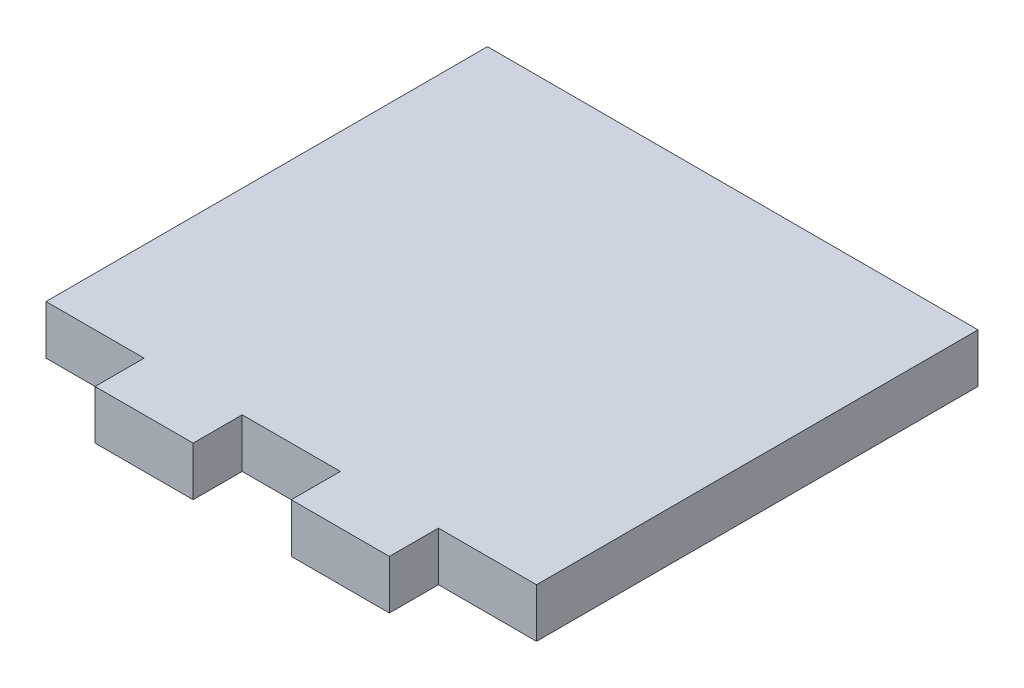
ISO-10303-21;
HEADER;
FILE_DESCRIPTION(('STEP AP214'),'2;1');
FILE_NAME('part.step','',(''),(''),'','','');
FILE_SCHEMA(('AUTOMOTIVE_DESIGN { 1 0 10303 214 1 1 1 1 }'));
ENDSEC;
DATA;
#1=APPLICATION_CONTEXT('core data for automotive mechanical design processes');
#2=APPLICATION_PROTOCOL_DEFINITION('international standard','automotive_design',2000,#1);
#3=PRODUCT_CONTEXT('',#1,'mechanical');
#4=PRODUCT('Part','Part','',(#3));
#5=PRODUCT_RELATED_PRODUCT_CATEGORY('part','',(#4));
#6=PRODUCT_DEFINITION_FORMATION('','',#4);
#7=PRODUCT_DEFINITION_CONTEXT('part definition',#1,'design');
#8=PRODUCT_DEFINITION('design','',#6,#7);
#9=PRODUCT_DEFINITION_SHAPE('','',#8);
#10=(LENGTH_UNIT() NAMED_UNIT(*) SI_UNIT(.MILLI.,.METRE.));
#11=(NAMED_UNIT(*) PLANE_ANGLE_UNIT() SI_UNIT($,.RADIAN.));
#12=(NAMED_UNIT(*) SI_UNIT($,.STERADIAN.) SOLID_ANGLE_UNIT());
#13=UNCERTAINTY_MEASURE_WITH_UNIT(LENGTH_MEASURE(1.E-05),#10,'distance_accuracy_value','');
#14=(GEOMETRIC_REPRESENTATION_CONTEXT(3) GLOBAL_UNCERTAINTY_ASSIGNED_CONTEXT((#13)) GLOBAL_UNIT_ASSIGNED_CONTEXT((#10,
#11,#12)) REPRESENTATION_CONTEXT('',''));
#15=CARTESIAN_POINT('',(0.,0.,0.));
#16=DIRECTION('',(0.,0.,1.));
#17=DIRECTION('',(1.,0.,0.));
#18=AXIS2_PLACEMENT_3D('',#15,#16,#17);
#19=CARTESIAN_POINT('',(-50.,10.,50.));
#20=DIRECTION('',(0.,0.,-1.));
#21=DIRECTION('',(-1.,0.,0.));
#22=AXIS2_PLACEMENT_3D('',#19,#20,#21);
#23=PLANE('',#22);
#24=DIRECTION('',(1.,0.,0.));
#25=VECTOR('',#24,1.);
#26=CARTESIAN_POINT('',(-50.,0.,50.));
#27=LINE('',#26,#25);
#28=CARTESIAN_POINT('',(-30.,0.,50.));
#29=VERTEX_POINT('',#28);
#30=CARTESIAN_POINT('',(-10.,0.,50.));
#31=VERTEX_POINT('',#30);
#32=EDGE_CURVE('E156',#29,#31,#27,.T.);
#33=ORIENTED_EDGE('',*,*,#32,.T.);
#34=DIRECTION('',(0.,1.,0.));
#35=VECTOR('',#34,1.);
#36=CARTESIAN_POINT('',(-10.,0.,50.));
#37=LINE('',#36,#35);
#38=CARTESIAN_POINT('',(-10.,10.,50.));
#39=VERTEX_POINT('',#38);
#40=EDGE_CURVE('E194',#31,#39,#37,.T.);
#41=ORIENTED_EDGE('',*,*,#40,.T.);
#42=DIRECTION('',(1.,0.,0.));
#43=VECTOR('',#42,1.);
#44=CARTESIAN_POINT('',(-50.,10.,50.));
#45=LINE('',#44,#43);
#46=CARTESIAN_POINT('',(-30.,10.,50.));
#47=VERTEX_POINT('',#46);
#48=EDGE_CURVE('E150',#47,#39,#45,.T.);
#49=ORIENTED_EDGE('',*,*,#48,.F.);
#50=DIRECTION('',(0.,1.,0.));
#51=VECTOR('',#50,1.);
#52=CARTESIAN_POINT('',(-30.,0.,50.));
#53=LINE('',#52,#51);
#54=EDGE_CURVE('E179',#29,#47,#53,.T.);
#55=ORIENTED_EDGE('',*,*,#54,.F.);
#56=EDGE_LOOP('',(#33,#41,#49,#55));
#57=FACE_BOUND('',#56,.T.);
#58=ADVANCED_FACE('F33',(#57),#23,.F.);
#59=CARTESIAN_POINT('',(50.,10.,-50.));
#60=DIRECTION('',(-1.,0.,0.));
#61=DIRECTION('',(0.,0.,1.));
#62=AXIS2_PLACEMENT_3D('',#59,#60,#61);
#63=PLANE('',#62);
#64=DIRECTION('',(0.,0.,-1.));
#65=VECTOR('',#64,1.);
#66=CARTESIAN_POINT('',(50.,10.,-50.));
#67=LINE('',#66,#65);
#68=CARTESIAN_POINT('',(50.,10.,40.));
#69=VERTEX_POINT('',#68);
#70=CARTESIAN_POINT('',(50.,10.,-50.));
#71=VERTEX_POINT('',#70);
#72=EDGE_CURVE('E137',#69,#71,#67,.T.);
#73=ORIENTED_EDGE('',*,*,#72,.F.);
#74=DIRECTION('',(0.,1.,0.));
#75=VECTOR('',#74,1.);
#76=CARTESIAN_POINT('',(50.,0.,40.));
#77=LINE('',#76,#75);
#78=CARTESIAN_POINT('',(50.,0.,40.));
#79=VERTEX_POINT('',#78);
#80=EDGE_CURVE('E125',#79,#69,#77,.T.);
#81=ORIENTED_EDGE('',*,*,#80,.F.);
#82=DIRECTION('',(0.,0.,-1.));
#83=VECTOR('',#82,1.);
#84=CARTESIAN_POINT('',(50.,0.,-50.));
#85=LINE('',#84,#83);
#86=CARTESIAN_POINT('',(50.,0.,-50.));
#87=VERTEX_POINT('',#86);
#88=EDGE_CURVE('E135',#79,#87,#85,.T.);
#89=ORIENTED_EDGE('',*,*,#88,.T.);
#90=DIRECTION('',(0.,-1.,0.));
#91=VECTOR('',#90,1.);
#92=CARTESIAN_POINT('',(50.,10.,-50.));
#93=LINE('',#92,#91);
#94=EDGE_CURVE('E11',#71,#87,#93,.T.);
#95=ORIENTED_EDGE('',*,*,#94,.F.);
#96=EDGE_LOOP('',(#73,#81,#89,#95));
#97=FACE_BOUND('',#96,.T.);
#98=ADVANCED_FACE('F35',(#97),#63,.F.);
#99=CARTESIAN_POINT('',(-50.,10.,-50.));
#100=DIRECTION('',(0.,0.,1.));
#101=DIRECTION('',(1.,0.,0.));
#102=AXIS2_PLACEMENT_3D('',#99,#100,#101);
#103=PLANE('',#102);
#104=DIRECTION('',(-1.,0.,0.));
#105=VECTOR('',#104,1.);
#106=CARTESIAN_POINT('',(-50.,0.,-50.));
#107=LINE('',#106,#105);
#108=CARTESIAN_POINT('',(-50.,0.,-50.));
#109=VERTEX_POINT('',#108);
#110=EDGE_CURVE('E141',#87,#109,#107,.T.);
#111=ORIENTED_EDGE('',*,*,#110,.T.);
#112=DIRECTION('',(0.,-1.,0.));
#113=VECTOR('',#112,1.);
#114=CARTESIAN_POINT('',(-50.,10.,-50.));
#115=LINE('',#114,#113);
#116=CARTESIAN_POINT('',(-50.,10.,-50.));
#117=VERTEX_POINT('',#116);
#118=EDGE_CURVE('E41',#117,#109,#115,.T.);
#119=ORIENTED_EDGE('',*,*,#118,.F.);
#120=DIRECTION('',(-1.,0.,0.));
#121=VECTOR('',#120,1.);
#122=CARTESIAN_POINT('',(-50.,10.,-50.));
#123=LINE('',#122,#121);
#124=EDGE_CURVE('E174',#71,#117,#123,.T.);
#125=ORIENTED_EDGE('',*,*,#124,.F.);
#126=ORIENTED_EDGE('',*,*,#94,.T.);
#127=EDGE_LOOP('',(#111,#119,#125,#126));
#128=FACE_BOUND('',#127,.T.);
#129=ADVANCED_FACE('F246',(#128),#103,.F.);
#130=CARTESIAN_POINT('',(-50.,10.,-50.));
#131=DIRECTION('',(1.,0.,0.));
#132=DIRECTION('',(0.,0.,-1.));
#133=AXIS2_PLACEMENT_3D('',#130,#131,#132);
#134=PLANE('',#133);
#135=DIRECTION('',(0.,0.,1.));
#136=VECTOR('',#135,1.);
#137=CARTESIAN_POINT('',(-50.,0.,-50.));
#138=LINE('',#137,#136);
#139=CARTESIAN_POINT('',(-50.,0.,40.));
#140=VERTEX_POINT('',#139);
#141=EDGE_CURVE('E144',#109,#140,#138,.T.);
#142=ORIENTED_EDGE('',*,*,#141,.T.);
#143=DIRECTION('',(0.,1.,0.));
#144=VECTOR('',#143,1.);
#145=CARTESIAN_POINT('',(-50.,0.,40.));
#146=LINE('',#145,#144);
#147=CARTESIAN_POINT('',(-50.,10.,40.));
#148=VERTEX_POINT('',#147);
#149=EDGE_CURVE('E142',#140,#148,#146,.T.);
#150=ORIENTED_EDGE('',*,*,#149,.T.);
#151=DIRECTION('',(0.,0.,1.));
#152=VECTOR('',#151,1.);
#153=CARTESIAN_POINT('',(-50.,10.,-50.));
#154=LINE('',#153,#152);
#155=EDGE_CURVE('E169',#117,#148,#154,.T.);
#156=ORIENTED_EDGE('',*,*,#155,.F.);
#157=ORIENTED_EDGE('',*,*,#118,.T.);
#158=EDGE_LOOP('',(#142,#150,#156,#157));
#159=FACE_BOUND('',#158,.T.);
#160=ADVANCED_FACE('F244',(#159),#134,.F.);
#161=CARTESIAN_POINT('',(10.,0.,50.));
#162=VERTEX_POINT('',#161);
#163=CARTESIAN_POINT('',(30.,0.,50.));
#164=VERTEX_POINT('',#163);
#165=EDGE_CURVE('E155',#162,#164,#27,.T.);
#166=ORIENTED_EDGE('',*,*,#165,.T.);
#167=DIRECTION('',(0.,1.,0.));
#168=VECTOR('',#167,1.);
#169=CARTESIAN_POINT('',(30.,0.,50.));
#170=LINE('',#169,#168);
#171=CARTESIAN_POINT('',(30.,10.,50.));
#172=VERTEX_POINT('',#171);
#173=EDGE_CURVE('E211',#164,#172,#170,.T.);
#174=ORIENTED_EDGE('',*,*,#173,.T.);
#175=CARTESIAN_POINT('',(10.,10.,50.));
#176=VERTEX_POINT('',#175);
#177=EDGE_CURVE('E163',#176,#172,#45,.T.);
#178=ORIENTED_EDGE('',*,*,#177,.F.);
#179=DIRECTION('',(0.,1.,0.));
#180=VECTOR('',#179,1.);
#181=CARTESIAN_POINT('',(10.,0.,50.));
#182=LINE('',#181,#180);
#183=EDGE_CURVE('E197',#162,#176,#182,.T.);
#184=ORIENTED_EDGE('',*,*,#183,.F.);
#185=EDGE_LOOP('',(#166,#174,#178,#184));
#186=FACE_BOUND('',#185,.T.);
#187=ADVANCED_FACE('F228',(#186),#23,.F.);
#188=CARTESIAN_POINT('',(0.,10.,0.));
#189=DIRECTION('',(0.,1.,0.));
#190=DIRECTION('',(0.,0.,1.));
#191=AXIS2_PLACEMENT_3D('',#188,#189,#190);
#192=PLANE('',#191);
#193=DIRECTION('',(0.,0.,1.));
#194=VECTOR('',#193,1.);
#195=CARTESIAN_POINT('',(30.,10.,50.));
#196=LINE('',#195,#194);
#197=CARTESIAN_POINT('',(30.,10.,40.));
#198=VERTEX_POINT('',#197);
#199=EDGE_CURVE('E130',#198,#172,#196,.T.);
#200=ORIENTED_EDGE('',*,*,#199,.F.);
#201=DIRECTION('',(-1.,0.,0.));
#202=VECTOR('',#201,1.);
#203=CARTESIAN_POINT('',(50.,10.,40.));
#204=LINE('',#203,#202);
#205=EDGE_CURVE('E222',#69,#198,#204,.T.);
#206=ORIENTED_EDGE('',*,*,#205,.F.);
#207=ORIENTED_EDGE('',*,*,#72,.T.);
#208=ORIENTED_EDGE('',*,*,#124,.T.);
#209=ORIENTED_EDGE('',*,*,#155,.T.);
#210=DIRECTION('',(-1.,0.,0.));
#211=VECTOR('',#210,1.);
#212=CARTESIAN_POINT('',(-50.,10.,40.));
#213=LINE('',#212,#211);
#214=CARTESIAN_POINT('',(-30.,10.,40.));
#215=VERTEX_POINT('',#214);
#216=EDGE_CURVE('E183',#215,#148,#213,.T.);
#217=ORIENTED_EDGE('',*,*,#216,.F.);
#218=DIRECTION('',(0.,0.,-1.));
#219=VECTOR('',#218,1.);
#220=CARTESIAN_POINT('',(-30.,10.,50.));
#221=LINE('',#220,#219);
#222=EDGE_CURVE('E186',#47,#215,#221,.T.);
#223=ORIENTED_EDGE('',*,*,#222,.F.);
#224=ORIENTED_EDGE('',*,*,#48,.T.);
#225=DIRECTION('',(0.,0.,1.));
#226=VECTOR('',#225,1.);
#227=CARTESIAN_POINT('',(-10.,10.,50.));
#228=LINE('',#227,#226);
#229=CARTESIAN_POINT('',(-10.,10.,40.));
#230=VERTEX_POINT('',#229);
#231=EDGE_CURVE('E209',#230,#39,#228,.T.);
#232=ORIENTED_EDGE('',*,*,#231,.F.);
#233=DIRECTION('',(-1.,0.,0.));
#234=VECTOR('',#233,1.);
#235=CARTESIAN_POINT('',(-10.,10.,40.));
#236=LINE('',#235,#234);
#237=CARTESIAN_POINT('',(10.,10.,40.));
#238=VERTEX_POINT('',#237);
#239=EDGE_CURVE('E202',#238,#230,#236,.T.);
#240=ORIENTED_EDGE('',*,*,#239,.F.);
#241=DIRECTION('',(0.,0.,-1.));
#242=VECTOR('',#241,1.);
#243=CARTESIAN_POINT('',(10.,10.,50.));
#244=LINE('',#243,#242);
#245=EDGE_CURVE('E206',#176,#238,#244,.T.);
#246=ORIENTED_EDGE('',*,*,#245,.F.);
#247=ORIENTED_EDGE('',*,*,#177,.T.);
#248=EDGE_LOOP('',(#200,#206,#207,#208,#209,#217,#223,#224,#232,#240,#246,#247));
#249=FACE_BOUND('',#248,.T.);
#250=ADVANCED_FACE('F232',(#249),#192,.T.);
#251=CARTESIAN_POINT('',(0.,0.,0.));
#252=DIRECTION('',(0.,1.,0.));
#253=DIRECTION('',(0.,0.,1.));
#254=AXIS2_PLACEMENT_3D('',#251,#252,#253);
#255=PLANE('',#254);
#256=DIRECTION('',(-1.,0.,0.));
#257=VECTOR('',#256,1.);
#258=CARTESIAN_POINT('',(50.,0.,40.));
#259=LINE('',#258,#257);
#260=CARTESIAN_POINT('',(30.,0.,40.));
#261=VERTEX_POINT('',#260);
#262=EDGE_CURVE('E121',#79,#261,#259,.T.);
#263=ORIENTED_EDGE('',*,*,#262,.T.);
#264=DIRECTION('',(0.,0.,1.));
#265=VECTOR('',#264,1.);
#266=CARTESIAN_POINT('',(30.,0.,50.));
#267=LINE('',#266,#265);
#268=EDGE_CURVE('E48',#261,#164,#267,.T.);
#269=ORIENTED_EDGE('',*,*,#268,.T.);
#270=ORIENTED_EDGE('',*,*,#165,.F.);
#271=DIRECTION('',(0.,0.,-1.));
#272=VECTOR('',#271,1.);
#273=CARTESIAN_POINT('',(10.,0.,50.));
#274=LINE('',#273,#272);
#275=CARTESIAN_POINT('',(10.,0.,40.));
#276=VERTEX_POINT('',#275);
#277=EDGE_CURVE('E213',#162,#276,#274,.T.);
#278=ORIENTED_EDGE('',*,*,#277,.T.);
#279=DIRECTION('',(-1.,0.,0.));
#280=VECTOR('',#279,1.);
#281=CARTESIAN_POINT('',(-10.,0.,40.));
#282=LINE('',#281,#280);
#283=CARTESIAN_POINT('',(-10.,0.,40.));
#284=VERTEX_POINT('',#283);
#285=EDGE_CURVE('E56',#276,#284,#282,.T.);
#286=ORIENTED_EDGE('',*,*,#285,.T.);
#287=DIRECTION('',(0.,0.,1.));
#288=VECTOR('',#287,1.);
#289=CARTESIAN_POINT('',(-10.,0.,50.));
#290=LINE('',#289,#288);
#291=EDGE_CURVE('E205',#284,#31,#290,.T.);
#292=ORIENTED_EDGE('',*,*,#291,.T.);
#293=ORIENTED_EDGE('',*,*,#32,.F.);
#294=DIRECTION('',(0.,0.,-1.));
#295=VECTOR('',#294,1.);
#296=CARTESIAN_POINT('',(-30.,0.,50.));
#297=LINE('',#296,#295);
#298=CARTESIAN_POINT('',(-30.,0.,40.));
#299=VERTEX_POINT('',#298);
#300=EDGE_CURVE('E185',#29,#299,#297,.T.);
#301=ORIENTED_EDGE('',*,*,#300,.T.);
#302=DIRECTION('',(-1.,0.,0.));
#303=VECTOR('',#302,1.);
#304=CARTESIAN_POINT('',(-50.,0.,40.));
#305=LINE('',#304,#303);
#306=EDGE_CURVE('E181',#299,#140,#305,.T.);
#307=ORIENTED_EDGE('',*,*,#306,.T.);
#308=ORIENTED_EDGE('',*,*,#141,.F.);
#309=ORIENTED_EDGE('',*,*,#110,.F.);
#310=ORIENTED_EDGE('',*,*,#88,.F.);
#311=EDGE_LOOP('',(#263,#269,#270,#278,#286,#292,#293,#301,#307,#308,#309,#310));
#312=FACE_BOUND('',#311,.T.);
#313=ADVANCED_FACE('F139',(#312),#255,.F.);
#314=CARTESIAN_POINT('',(-50.,0.,40.));
#315=DIRECTION('',(0.,0.,-1.));
#316=DIRECTION('',(-1.,0.,0.));
#317=AXIS2_PLACEMENT_3D('',#314,#315,#316);
#318=PLANE('',#317);
#319=ORIENTED_EDGE('',*,*,#216,.T.);
#320=ORIENTED_EDGE('',*,*,#149,.F.);
#321=ORIENTED_EDGE('',*,*,#306,.F.);
#322=DIRECTION('',(0.,1.,0.));
#323=VECTOR('',#322,1.);
#324=CARTESIAN_POINT('',(-30.,0.,40.));
#325=LINE('',#324,#323);
#326=EDGE_CURVE('E147',#299,#215,#325,.T.);
#327=ORIENTED_EDGE('',*,*,#326,.T.);
#328=EDGE_LOOP('',(#319,#320,#321,#327));
#329=FACE_BOUND('',#328,.T.);
#330=ADVANCED_FACE('F243',(#329),#318,.F.);
#331=CARTESIAN_POINT('',(-30.,0.,50.));
#332=DIRECTION('',(1.,0.,0.));
#333=DIRECTION('',(0.,0.,-1.));
#334=AXIS2_PLACEMENT_3D('',#331,#332,#333);
#335=PLANE('',#334);
#336=ORIENTED_EDGE('',*,*,#222,.T.);
#337=ORIENTED_EDGE('',*,*,#326,.F.);
#338=ORIENTED_EDGE('',*,*,#300,.F.);
#339=ORIENTED_EDGE('',*,*,#54,.T.);
#340=EDGE_LOOP('',(#336,#337,#338,#339));
#341=FACE_BOUND('',#340,.T.);
#342=ADVANCED_FACE('F240',(#341),#335,.F.);
#343=CARTESIAN_POINT('',(-10.,0.,50.));
#344=DIRECTION('',(-1.,0.,0.));
#345=DIRECTION('',(0.,0.,1.));
#346=AXIS2_PLACEMENT_3D('',#343,#344,#345);
#347=PLANE('',#346);
#348=ORIENTED_EDGE('',*,*,#231,.T.);
#349=ORIENTED_EDGE('',*,*,#40,.F.);
#350=ORIENTED_EDGE('',*,*,#291,.F.);
#351=DIRECTION('',(0.,1.,0.));
#352=VECTOR('',#351,1.);
#353=CARTESIAN_POINT('',(-10.,0.,40.));
#354=LINE('',#353,#352);
#355=EDGE_CURVE('E189',#284,#230,#354,.T.);
#356=ORIENTED_EDGE('',*,*,#355,.T.);
#357=EDGE_LOOP('',(#348,#349,#350,#356));
#358=FACE_BOUND('',#357,.T.);
#359=ADVANCED_FACE('F265',(#358),#347,.F.);
#360=CARTESIAN_POINT('',(-10.,0.,40.));
#361=DIRECTION('',(0.,0.,-1.));
#362=DIRECTION('',(-1.,0.,0.));
#363=AXIS2_PLACEMENT_3D('',#360,#361,#362);
#364=PLANE('',#363);
#365=ORIENTED_EDGE('',*,*,#239,.T.);
#366=ORIENTED_EDGE('',*,*,#355,.F.);
#367=ORIENTED_EDGE('',*,*,#285,.F.);
#368=DIRECTION('',(0.,1.,0.));
#369=VECTOR('',#368,1.);
#370=CARTESIAN_POINT('',(10.,0.,40.));
#371=LINE('',#370,#369);
#372=EDGE_CURVE('E199',#276,#238,#371,.T.);
#373=ORIENTED_EDGE('',*,*,#372,.T.);
#374=EDGE_LOOP('',(#365,#366,#367,#373));
#375=FACE_BOUND('',#374,.T.);
#376=ADVANCED_FACE('F233',(#375),#364,.F.);
#377=CARTESIAN_POINT('',(10.,0.,50.));
#378=DIRECTION('',(1.,0.,0.));
#379=DIRECTION('',(0.,0.,-1.));
#380=AXIS2_PLACEMENT_3D('',#377,#378,#379);
#381=PLANE('',#380);
#382=ORIENTED_EDGE('',*,*,#245,.T.);
#383=ORIENTED_EDGE('',*,*,#372,.F.);
#384=ORIENTED_EDGE('',*,*,#277,.F.);
#385=ORIENTED_EDGE('',*,*,#183,.T.);
#386=EDGE_LOOP('',(#382,#383,#384,#385));
#387=FACE_BOUND('',#386,.T.);
#388=ADVANCED_FACE('F230',(#387),#381,.F.);
#389=CARTESIAN_POINT('',(30.,0.,50.));
#390=DIRECTION('',(-1.,0.,0.));
#391=DIRECTION('',(0.,0.,1.));
#392=AXIS2_PLACEMENT_3D('',#389,#390,#391);
#393=PLANE('',#392);
#394=ORIENTED_EDGE('',*,*,#199,.T.);
#395=ORIENTED_EDGE('',*,*,#173,.F.);
#396=ORIENTED_EDGE('',*,*,#268,.F.);
#397=DIRECTION('',(0.,1.,0.));
#398=VECTOR('',#397,1.);
#399=CARTESIAN_POINT('',(30.,0.,40.));
#400=LINE('',#399,#398);
#401=EDGE_CURVE('E127',#261,#198,#400,.T.);
#402=ORIENTED_EDGE('',*,*,#401,.T.);
#403=EDGE_LOOP('',(#394,#395,#396,#402));
#404=FACE_BOUND('',#403,.T.);
#405=ADVANCED_FACE('F272',(#404),#393,.F.);
#406=CARTESIAN_POINT('',(50.,0.,40.));
#407=DIRECTION('',(0.,0.,-1.));
#408=DIRECTION('',(-1.,0.,0.));
#409=AXIS2_PLACEMENT_3D('',#406,#407,#408);
#410=PLANE('',#409);
#411=ORIENTED_EDGE('',*,*,#205,.T.);
#412=ORIENTED_EDGE('',*,*,#401,.F.);
#413=ORIENTED_EDGE('',*,*,#262,.F.);
#414=ORIENTED_EDGE('',*,*,#80,.T.);
#415=EDGE_LOOP('',(#411,#412,#413,#414));
#416=FACE_BOUND('',#415,.T.);
#417=ADVANCED_FACE('F124',(#416),#410,.F.);
#418=CLOSED_SHELL('',(#58,#98,#129,#160,#187,#250,#313,#330,#342,#359,#376,#388,#405,#417));
#419=MANIFOLD_SOLID_BREP('B2',#418);
#420=ADVANCED_BREP_SHAPE_REPRESENTATION('',(#18,#419),#14);
#421=SHAPE_DEFINITION_REPRESENTATION(#9,#420);
ENDSEC;
END-ISO-10303-21;
